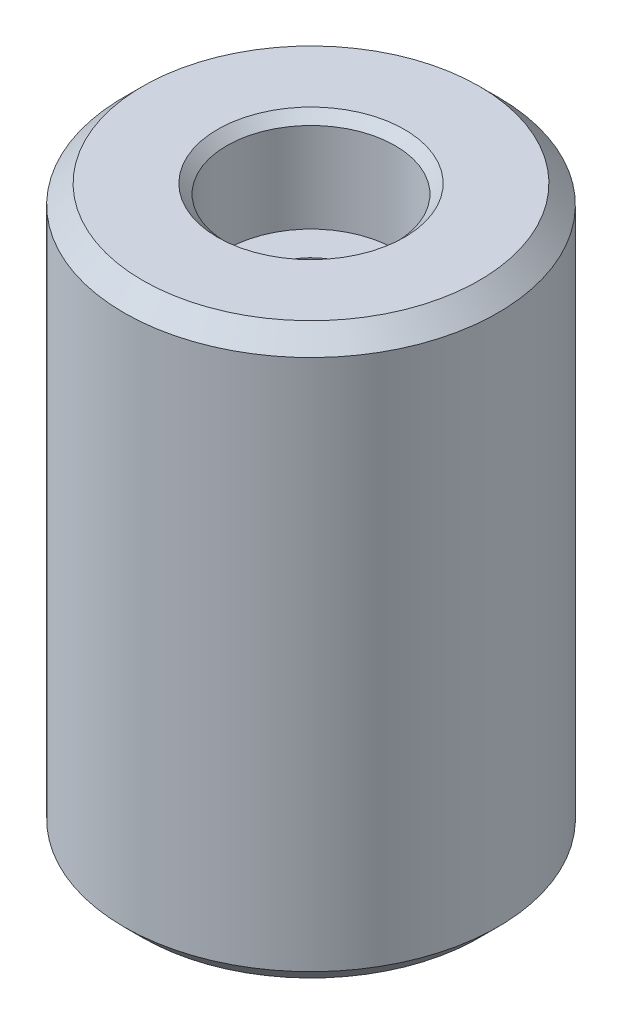
ISO-10303-21;
HEADER;
FILE_DESCRIPTION(('STEP AP214'),'2;1');
FILE_NAME('part.step','',(''),(''),'','','');
FILE_SCHEMA(('AUTOMOTIVE_DESIGN { 1 0 10303 214 1 1 1 1 }'));
ENDSEC;
DATA;
#1=APPLICATION_CONTEXT('core data for automotive mechanical design processes');
#2=APPLICATION_PROTOCOL_DEFINITION('international standard','automotive_design',2000,#1);
#3=PRODUCT_CONTEXT('',#1,'mechanical');
#4=PRODUCT('Part','Part','',(#3));
#5=PRODUCT_RELATED_PRODUCT_CATEGORY('part','',(#4));
#6=PRODUCT_DEFINITION_FORMATION('','',#4);
#7=PRODUCT_DEFINITION_CONTEXT('part definition',#1,'design');
#8=PRODUCT_DEFINITION('design','',#6,#7);
#9=PRODUCT_DEFINITION_SHAPE('','',#8);
#10=(LENGTH_UNIT() NAMED_UNIT(*) SI_UNIT(.MILLI.,.METRE.));
#11=(NAMED_UNIT(*) PLANE_ANGLE_UNIT() SI_UNIT($,.RADIAN.));
#12=(NAMED_UNIT(*) SI_UNIT($,.STERADIAN.) SOLID_ANGLE_UNIT());
#13=UNCERTAINTY_MEASURE_WITH_UNIT(LENGTH_MEASURE(1.E-05),#10,'distance_accuracy_value','');
#14=(GEOMETRIC_REPRESENTATION_CONTEXT(3) GLOBAL_UNCERTAINTY_ASSIGNED_CONTEXT((#13)) GLOBAL_UNIT_ASSIGNED_CONTEXT((#10,
#11,#12)) REPRESENTATION_CONTEXT('',''));
#15=CARTESIAN_POINT('',(0.,0.,0.));
#16=DIRECTION('',(0.,0.,1.));
#17=DIRECTION('',(1.,0.,0.));
#18=AXIS2_PLACEMENT_3D('',#15,#16,#17);
#19=CARTESIAN_POINT('',(0.,-60.9,0.));
#20=DIRECTION('',(0.,1.,0.));
#21=DIRECTION('',(0.,0.,1.));
#22=AXIS2_PLACEMENT_3D('',#19,#20,#21);
#23=CYLINDRICAL_SURFACE('',#22,20.);
#24=CARTESIAN_POINT('',(0.,-58.9,0.));
#25=DIRECTION('',(0.,1.,0.));
#26=DIRECTION('',(0.,0.,1.));
#27=AXIS2_PLACEMENT_3D('',#24,#25,#26);
#28=CIRCLE('',#27,20.);
#29=CARTESIAN_POINT('',(0.,-58.9,20.));
#30=VERTEX_POINT('',#29);
#31=EDGE_CURVE('E68',#30,#30,#28,.T.);
#32=CARTESIAN_POINT('',(0.,-1.99999999999997,0.));
#33=DIRECTION('',(0.,1.,0.));
#34=DIRECTION('',(0.,0.,1.));
#35=AXIS2_PLACEMENT_3D('',#32,#33,#34);
#36=CIRCLE('',#35,20.);
#37=CARTESIAN_POINT('',(0.,-1.99999999999997,20.));
#38=VERTEX_POINT('',#37);
#39=EDGE_CURVE('E71',#38,#38,#36,.F.);
#40=CARTESIAN_POINT('',(0.,-58.9,20.));
#41=CARTESIAN_POINT('',(0.,-58.3072916666667,20.));
#42=CARTESIAN_POINT('',(0.,-57.7145833333333,20.));
#43=CARTESIAN_POINT('',(0.,-56.5291666666667,20.));
#44=CARTESIAN_POINT('',(0.,-55.9364583333333,20.));
#45=CARTESIAN_POINT('',(0.,-54.7510416666667,20.));
#46=CARTESIAN_POINT('',(0.,-54.1583333333333,20.));
#47=CARTESIAN_POINT('',(0.,-52.9729166666667,20.));
#48=CARTESIAN_POINT('',(0.,-52.3802083333333,20.));
#49=CARTESIAN_POINT('',(0.,-51.1947916666666,20.));
#50=CARTESIAN_POINT('',(0.,-50.6020833333333,20.));
#51=CARTESIAN_POINT('',(0.,-49.4166666666667,20.));
#52=CARTESIAN_POINT('',(0.,-48.8239583333333,20.));
#53=CARTESIAN_POINT('',(0.,-47.6385416666667,20.));
#54=CARTESIAN_POINT('',(0.,-47.0458333333333,20.));
#55=CARTESIAN_POINT('',(0.,-45.8604166666666,20.));
#56=CARTESIAN_POINT('',(0.,-45.2677083333333,20.));
#57=CARTESIAN_POINT('',(0.,-44.0822916666666,20.));
#58=CARTESIAN_POINT('',(0.,-43.4895833333333,20.));
#59=CARTESIAN_POINT('',(0.,-42.3041666666667,20.));
#60=CARTESIAN_POINT('',(0.,-41.7114583333333,20.));
#61=CARTESIAN_POINT('',(0.,-40.5260416666666,20.));
#62=CARTESIAN_POINT('',(0.,-39.9333333333333,20.));
#63=CARTESIAN_POINT('',(0.,-38.7479166666666,20.));
#64=CARTESIAN_POINT('',(0.,-38.1552083333333,20.));
#65=CARTESIAN_POINT('',(0.,-36.9697916666666,20.));
#66=CARTESIAN_POINT('',(0.,-36.3770833333333,20.));
#67=CARTESIAN_POINT('',(0.,-35.1916666666666,20.));
#68=CARTESIAN_POINT('',(0.,-34.5989583333333,20.));
#69=CARTESIAN_POINT('',(0.,-33.4135416666666,20.));
#70=CARTESIAN_POINT('',(0.,-32.8208333333333,20.));
#71=CARTESIAN_POINT('',(0.,-31.6354166666666,20.));
#72=CARTESIAN_POINT('',(0.,-31.0427083333333,20.));
#73=CARTESIAN_POINT('',(0.,-29.8572916666666,20.));
#74=CARTESIAN_POINT('',(0.,-29.2645833333333,20.));
#75=CARTESIAN_POINT('',(0.,-28.0791666666666,20.));
#76=CARTESIAN_POINT('',(0.,-27.4864583333333,20.));
#77=CARTESIAN_POINT('',(0.,-26.3010416666666,20.));
#78=CARTESIAN_POINT('',(0.,-25.7083333333333,20.));
#79=CARTESIAN_POINT('',(0.,-24.5229166666666,20.));
#80=CARTESIAN_POINT('',(0.,-23.9302083333333,20.));
#81=CARTESIAN_POINT('',(0.,-22.7447916666666,20.));
#82=CARTESIAN_POINT('',(0.,-22.1520833333333,20.));
#83=CARTESIAN_POINT('',(0.,-20.9666666666666,20.));
#84=CARTESIAN_POINT('',(0.,-20.3739583333333,20.));
#85=CARTESIAN_POINT('',(0.,-19.1885416666666,20.));
#86=CARTESIAN_POINT('',(0.,-18.5958333333333,20.));
#87=CARTESIAN_POINT('',(0.,-17.4104166666666,20.));
#88=CARTESIAN_POINT('',(0.,-16.8177083333333,20.));
#89=CARTESIAN_POINT('',(0.,-15.6322916666666,20.));
#90=CARTESIAN_POINT('',(0.,-15.0395833333333,20.));
#91=CARTESIAN_POINT('',(0.,-13.8541666666666,20.));
#92=CARTESIAN_POINT('',(0.,-13.2614583333333,20.));
#93=CARTESIAN_POINT('',(0.,-12.0760416666666,20.));
#94=CARTESIAN_POINT('',(0.,-11.4833333333333,20.));
#95=CARTESIAN_POINT('',(0.,-10.2979166666666,20.));
#96=CARTESIAN_POINT('',(0.,-9.70520833333331,20.));
#97=CARTESIAN_POINT('',(0.,-8.51979166666664,20.));
#98=CARTESIAN_POINT('',(0.,-7.92708333333331,20.));
#99=CARTESIAN_POINT('',(0.,-6.74166666666664,20.));
#100=CARTESIAN_POINT('',(0.,-6.14895833333331,20.));
#101=CARTESIAN_POINT('',(0.,-4.96354166666664,20.));
#102=CARTESIAN_POINT('',(0.,-4.37083333333331,20.));
#103=CARTESIAN_POINT('',(0.,-3.18541666666664,20.));
#104=CARTESIAN_POINT('',(0.,-2.5927083333333,20.));
#105=CARTESIAN_POINT('',(0.,-1.99999999999997,20.));
#106=B_SPLINE_CURVE_WITH_KNOTS('',3,(#40,#41,#42,#43,#44,#45,#46,#47,#48,#49,#50,#51,#52,#53,
#54,#55,#56,#57,#58,#59,#60,#61,#62,#63,#64,#65,#66,#67,#68,#69,#70,#71,#72,#73,#74,#75,#76,#77,
#78,#79,#80,#81,#82,#83,#84,#85,#86,#87,#88,#89,#90,#91,#92,#93,#94,#95,#96,#97,#98,#99,#100,
#101,#102,#103,#104,#105),.UNSPECIFIED.,.F.,.F.,(4,2,2,2,2,2,2,2,2,2,2,2,2,2,2,2,2,2,2,2,2,2,2,
2,2,2,2,2,2,2,2,2,4),(0.,1.77812500000001,3.55625,5.334375,7.1125,8.89062500000001,10.66875,
12.446875,14.225,16.003125,17.78125,19.559375,21.3375,23.115625,24.89375,26.671875,28.45,
30.228125,32.00625,33.784375,35.5625,37.340625,39.11875,40.896875,42.675,44.453125,46.23125,
48.009375,49.7875,51.565625,53.34375,55.121875,56.9),.UNSPECIFIED.);
#107=EDGE_CURVE('BSEAM41',#30,#38,#106,.T.);
#108=ORIENTED_EDGE('',*,*,#31,.T.);
#109=ORIENTED_EDGE('',*,*,#39,.T.);
#110=ORIENTED_EDGE('',*,*,#107,.T.);
#111=ORIENTED_EDGE('',*,*,#107,.F.);
#112=EDGE_LOOP('',(#108,#110,#109,#111));
#113=FACE_BOUND('',#112,.T.);
#114=ADVANCED_FACE('F41',(#113),#23,.T.);
#115=CARTESIAN_POINT('',(0.,-60.9,0.));
#116=DIRECTION('',(0.,1.,0.));
#117=DIRECTION('',(0.,0.,1.));
#118=AXIS2_PLACEMENT_3D('',#115,#116,#117);
#119=PLANE('',#118);
#120=CARTESIAN_POINT('',(0.,-60.9,0.));
#121=DIRECTION('',(0.,1.,0.));
#122=DIRECTION('',(0.,0.,1.));
#123=AXIS2_PLACEMENT_3D('',#120,#121,#122);
#124=CIRCLE('',#123,6.24999999999998);
#125=CARTESIAN_POINT('',(0.,-60.9,6.24999999999998));
#126=VERTEX_POINT('',#125);
#127=EDGE_CURVE('E49',#126,#126,#124,.T.);
#128=ORIENTED_EDGE('',*,*,#127,.T.);
#129=EDGE_LOOP('',(#128));
#130=FACE_BOUND('',#129,.T.);
#131=CARTESIAN_POINT('',(0.,-60.9,0.));
#132=DIRECTION('',(0.,1.,0.));
#133=DIRECTION('',(0.,0.,1.));
#134=AXIS2_PLACEMENT_3D('',#131,#132,#133);
#135=CIRCLE('',#134,18.);
#136=CARTESIAN_POINT('',(0.,-60.9,18.));
#137=VERTEX_POINT('',#136);
#138=EDGE_CURVE('E65',#137,#137,#135,.F.);
#139=ORIENTED_EDGE('',*,*,#138,.T.);
#140=EDGE_LOOP('',(#139));
#141=FACE_BOUND('',#140,.T.);
#142=ADVANCED_FACE('F101',(#130,#141),#119,.F.);
#143=CARTESIAN_POINT('',(0.,0.,0.));
#144=DIRECTION('',(0.,1.,0.));
#145=DIRECTION('',(0.,0.,1.));
#146=AXIS2_PLACEMENT_3D('',#143,#144,#145);
#147=PLANE('',#146);
#148=CARTESIAN_POINT('',(0.,0.,0.));
#149=DIRECTION('',(0.,1.,0.));
#150=DIRECTION('',(0.,0.,1.));
#151=AXIS2_PLACEMENT_3D('',#148,#149,#150);
#152=CIRCLE('',#151,10.);
#153=CARTESIAN_POINT('',(0.,0.,10.));
#154=VERTEX_POINT('',#153);
#155=EDGE_CURVE('E53',#154,#154,#152,.F.);
#156=ORIENTED_EDGE('',*,*,#155,.T.);
#157=EDGE_LOOP('',(#156));
#158=FACE_BOUND('',#157,.T.);
#159=CARTESIAN_POINT('',(0.,0.,0.));
#160=DIRECTION('',(0.,1.,0.));
#161=DIRECTION('',(0.,0.,1.));
#162=AXIS2_PLACEMENT_3D('',#159,#160,#161);
#163=CIRCLE('',#162,18.);
#164=CARTESIAN_POINT('',(0.,0.,18.));
#165=VERTEX_POINT('',#164);
#166=EDGE_CURVE('E62',#165,#165,#163,.T.);
#167=ORIENTED_EDGE('',*,*,#166,.T.);
#168=EDGE_LOOP('',(#167));
#169=FACE_BOUND('',#168,.T.);
#170=ADVANCED_FACE('F107',(#158,#169),#147,.T.);
#171=CARTESIAN_POINT('',(0.,0.,0.));
#172=DIRECTION('',(0.,1.,0.));
#173=DIRECTION('',(0.,0.,1.));
#174=AXIS2_PLACEMENT_3D('',#171,#172,#173);
#175=CYLINDRICAL_SURFACE('',#174,5.25);
#176=CARTESIAN_POINT('',(0.,-59.9,0.));
#177=DIRECTION('',(0.,1.,0.));
#178=DIRECTION('',(0.,0.,1.));
#179=AXIS2_PLACEMENT_3D('',#176,#177,#178);
#180=CIRCLE('',#179,5.25);
#181=CARTESIAN_POINT('',(0.,-59.9,5.25));
#182=VERTEX_POINT('',#181);
#183=EDGE_CURVE('E10',#182,#182,#180,.F.);
#184=ORIENTED_EDGE('',*,*,#183,.T.);
#185=EDGE_LOOP('',(#184));
#186=FACE_BOUND('',#185,.T.);
#187=CARTESIAN_POINT('',(0.,-10.6,0.));
#188=DIRECTION('',(0.,1.,0.));
#189=DIRECTION('',(0.,0.,1.));
#190=AXIS2_PLACEMENT_3D('',#187,#188,#189);
#191=CIRCLE('',#190,5.25);
#192=CARTESIAN_POINT('',(0.,-10.6,5.25));
#193=VERTEX_POINT('',#192);
#194=EDGE_CURVE('E74',#193,#193,#191,.T.);
#195=ORIENTED_EDGE('',*,*,#194,.T.);
#196=EDGE_LOOP('',(#195));
#197=FACE_BOUND('',#196,.T.);
#198=ADVANCED_FACE('F97',(#186,#197),#175,.F.);
#199=CARTESIAN_POINT('',(5.25,-10.6,0.));
#200=DIRECTION('',(0.,-1.,0.));
#201=DIRECTION('',(0.,0.,-1.));
#202=AXIS2_PLACEMENT_3D('',#199,#200,#201);
#203=PLANE('',#202);
#204=ORIENTED_EDGE('',*,*,#194,.F.);
#205=EDGE_LOOP('',(#204));
#206=FACE_BOUND('',#205,.T.);
#207=CARTESIAN_POINT('',(0.,-10.6,0.));
#208=DIRECTION('',(0.,1.,0.));
#209=DIRECTION('',(0.,0.,1.));
#210=AXIS2_PLACEMENT_3D('',#207,#208,#209);
#211=CIRCLE('',#210,9.);
#212=CARTESIAN_POINT('',(0.,-10.6,9.));
#213=VERTEX_POINT('',#212);
#214=EDGE_CURVE('E77',#213,#213,#211,.T.);
#215=ORIENTED_EDGE('',*,*,#214,.T.);
#216=EDGE_LOOP('',(#215));
#217=FACE_BOUND('',#216,.T.);
#218=ADVANCED_FACE('F81',(#206,#217),#203,.F.);
#219=CARTESIAN_POINT('',(0.,0.,0.));
#220=DIRECTION('',(0.,1.,0.));
#221=DIRECTION('',(0.,0.,1.));
#222=AXIS2_PLACEMENT_3D('',#219,#220,#221);
#223=CYLINDRICAL_SURFACE('',#222,9.);
#224=CARTESIAN_POINT('',(0.,-1.00000000000001,0.));
#225=DIRECTION('',(0.,1.,0.));
#226=DIRECTION('',(0.,0.,1.));
#227=AXIS2_PLACEMENT_3D('',#224,#225,#226);
#228=CIRCLE('',#227,9.);
#229=CARTESIAN_POINT('',(0.,-1.00000000000001,9.));
#230=VERTEX_POINT('',#229);
#231=EDGE_CURVE('E57',#230,#230,#228,.T.);
#232=ORIENTED_EDGE('',*,*,#231,.T.);
#233=EDGE_LOOP('',(#232));
#234=FACE_BOUND('',#233,.T.);
#235=ORIENTED_EDGE('',*,*,#214,.F.);
#236=EDGE_LOOP('',(#235));
#237=FACE_BOUND('',#236,.T.);
#238=ADVANCED_FACE('F83',(#234,#237),#223,.F.);
#239=CARTESIAN_POINT('',(0.,-58.9,0.));
#240=DIRECTION('',(0.,1.,0.));
#241=DIRECTION('',(0.,0.,1.));
#242=AXIS2_PLACEMENT_3D('',#239,#240,#241);
#243=CONICAL_SURFACE('',#242,20.,0.78539816339745);
#244=ORIENTED_EDGE('',*,*,#138,.F.);
#245=EDGE_LOOP('',(#244));
#246=FACE_BOUND('',#245,.T.);
#247=ORIENTED_EDGE('',*,*,#31,.F.);
#248=EDGE_LOOP('',(#247));
#249=FACE_BOUND('',#248,.T.);
#250=ADVANCED_FACE('F85',(#246,#249),#243,.T.);
#251=CARTESIAN_POINT('',(0.,0.,0.));
#252=DIRECTION('',(0.,-1.,0.));
#253=DIRECTION('',(0.,0.,-1.));
#254=AXIS2_PLACEMENT_3D('',#251,#252,#253);
#255=CONICAL_SURFACE('',#254,18.,0.785398163397448);
#256=ORIENTED_EDGE('',*,*,#39,.F.);
#257=EDGE_LOOP('',(#256));
#258=FACE_BOUND('',#257,.T.);
#259=ORIENTED_EDGE('',*,*,#166,.F.);
#260=EDGE_LOOP('',(#259));
#261=FACE_BOUND('',#260,.T.);
#262=ADVANCED_FACE('F93',(#258,#261),#255,.T.);
#263=CARTESIAN_POINT('',(0.,-1.00000000000001,0.));
#264=DIRECTION('',(0.,1.,0.));
#265=DIRECTION('',(0.,0.,1.));
#266=AXIS2_PLACEMENT_3D('',#263,#264,#265);
#267=CONICAL_SURFACE('',#266,9.,0.78539816339745);
#268=ORIENTED_EDGE('',*,*,#155,.F.);
#269=EDGE_LOOP('',(#268));
#270=FACE_BOUND('',#269,.T.);
#271=ORIENTED_EDGE('',*,*,#231,.F.);
#272=EDGE_LOOP('',(#271));
#273=FACE_BOUND('',#272,.T.);
#274=ADVANCED_FACE('F120',(#270,#273),#267,.F.);
#275=CARTESIAN_POINT('',(0.,-60.9,0.));
#276=DIRECTION('',(0.,-1.,0.));
#277=DIRECTION('',(0.,0.,-1.));
#278=AXIS2_PLACEMENT_3D('',#275,#276,#277);
#279=CONICAL_SURFACE('',#278,6.24999999999998,0.785398163397443);
#280=ORIENTED_EDGE('',*,*,#183,.F.);
#281=EDGE_LOOP('',(#280));
#282=FACE_BOUND('',#281,.T.);
#283=ORIENTED_EDGE('',*,*,#127,.F.);
#284=EDGE_LOOP('',(#283));
#285=FACE_BOUND('',#284,.T.);
#286=ADVANCED_FACE('F44',(#282,#285),#279,.F.);
#287=CLOSED_SHELL('',(#114,#142,#170,#198,#218,#238,#250,#262,#274,#286));
#288=MANIFOLD_SOLID_BREP('B2',#287);
#289=ADVANCED_BREP_SHAPE_REPRESENTATION('',(#18,#288),#14);
#290=SHAPE_DEFINITION_REPRESENTATION(#9,#289);
ENDSEC;
END-ISO-10303-21;
